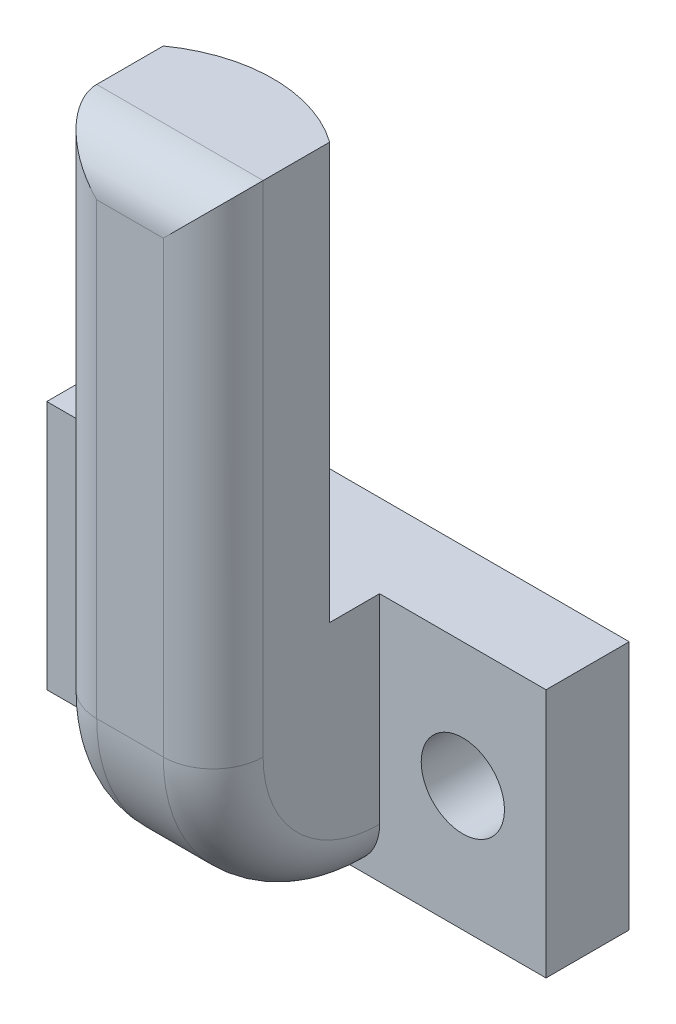
ISO-10303-21;
HEADER;
FILE_DESCRIPTION(('STEP AP214'),'2;1');
FILE_NAME('part.step','',(''),(''),'','','');
FILE_SCHEMA(('AUTOMOTIVE_DESIGN { 1 0 10303 214 1 1 1 1 }'));
ENDSEC;
DATA;
#1=APPLICATION_CONTEXT('core data for automotive mechanical design processes');
#2=APPLICATION_PROTOCOL_DEFINITION('international standard','automotive_design',2000,#1);
#3=PRODUCT_CONTEXT('',#1,'mechanical');
#4=PRODUCT('Part','Part','',(#3));
#5=PRODUCT_RELATED_PRODUCT_CATEGORY('part','',(#4));
#6=PRODUCT_DEFINITION_FORMATION('','',#4);
#7=PRODUCT_DEFINITION_CONTEXT('part definition',#1,'design');
#8=PRODUCT_DEFINITION('design','',#6,#7);
#9=PRODUCT_DEFINITION_SHAPE('','',#8);
#10=(LENGTH_UNIT() NAMED_UNIT(*) SI_UNIT(.MILLI.,.METRE.));
#11=(NAMED_UNIT(*) PLANE_ANGLE_UNIT() SI_UNIT($,.RADIAN.));
#12=(NAMED_UNIT(*) SI_UNIT($,.STERADIAN.) SOLID_ANGLE_UNIT());
#13=UNCERTAINTY_MEASURE_WITH_UNIT(LENGTH_MEASURE(1.E-05),#10,'distance_accuracy_value','');
#14=(GEOMETRIC_REPRESENTATION_CONTEXT(3) GLOBAL_UNCERTAINTY_ASSIGNED_CONTEXT((#13)) GLOBAL_UNIT_ASSIGNED_CONTEXT((#10,
#11,#12)) REPRESENTATION_CONTEXT('',''));
#15=CARTESIAN_POINT('',(0.,0.,0.));
#16=DIRECTION('',(0.,0.,1.));
#17=DIRECTION('',(1.,0.,0.));
#18=AXIS2_PLACEMENT_3D('',#15,#16,#17);
#19=CARTESIAN_POINT('',(0.,0.,5.));
#20=DIRECTION('',(0.,0.,1.));
#21=DIRECTION('',(1.,0.,0.));
#22=AXIS2_PLACEMENT_3D('',#19,#20,#21);
#23=PLANE('',#22);
#24=DIRECTION('',(0.,-1.,0.));
#25=VECTOR('',#24,1.);
#26=CARTESIAN_POINT('',(-5.,-7.5,5.));
#27=LINE('',#26,#25);
#28=CARTESIAN_POINT('',(-5.,7.5,5.));
#29=VERTEX_POINT('',#28);
#30=CARTESIAN_POINT('',(-5.,-4.5,5.));
#31=VERTEX_POINT('',#30);
#32=EDGE_CURVE('E219',#29,#31,#27,.T.);
#33=ORIENTED_EDGE('',*,*,#32,.F.);
#34=DIRECTION('',(-1.,0.,0.));
#35=VECTOR('',#34,1.);
#36=CARTESIAN_POINT('',(-15.,7.5,5.));
#37=LINE('',#36,#35);
#38=CARTESIAN_POINT('',(-15.,7.5,5.));
#39=VERTEX_POINT('',#38);
#40=EDGE_CURVE('E196',#29,#39,#37,.T.);
#41=ORIENTED_EDGE('',*,*,#40,.T.);
#42=DIRECTION('',(0.,-1.,0.));
#43=VECTOR('',#42,1.);
#44=CARTESIAN_POINT('',(-15.,7.5,5.));
#45=LINE('',#44,#43);
#46=CARTESIAN_POINT('',(-15.,-7.5,5.));
#47=VERTEX_POINT('',#46);
#48=EDGE_CURVE('E191',#39,#47,#45,.T.);
#49=ORIENTED_EDGE('',*,*,#48,.T.);
#50=DIRECTION('',(1.,0.,0.));
#51=VECTOR('',#50,1.);
#52=CARTESIAN_POINT('',(-15.,-7.5,5.));
#53=LINE('',#52,#51);
#54=CARTESIAN_POINT('',(-2.,-7.5,5.));
#55=VERTEX_POINT('',#54);
#56=EDGE_CURVE('E76',#47,#55,#53,.T.);
#57=ORIENTED_EDGE('',*,*,#56,.T.);
#58=CARTESIAN_POINT('',(-2.,-4.5,5.));
#59=DIRECTION('',(0.,0.,1.));
#60=DIRECTION('',(1.,0.,0.));
#61=AXIS2_PLACEMENT_3D('',#58,#59,#60);
#62=CIRCLE('',#61,3.);
#63=EDGE_CURVE('E46',#55,#31,#62,.F.);
#64=ORIENTED_EDGE('',*,*,#63,.T.);
#65=EDGE_LOOP('',(#33,#41,#49,#57,#64));
#66=FACE_BOUND('',#65,.T.);
#67=CARTESIAN_POINT('',(-10.,0.,5.));
#68=DIRECTION('',(0.,0.,1.));
#69=DIRECTION('',(1.,0.,0.));
#70=AXIS2_PLACEMENT_3D('',#67,#68,#69);
#71=CIRCLE('',#70,2.5);
#72=CARTESIAN_POINT('',(-7.5,0.,5.));
#73=VERTEX_POINT('',#72);
#74=EDGE_CURVE('E189',#73,#73,#71,.T.);
#75=ORIENTED_EDGE('',*,*,#74,.F.);
#76=EDGE_LOOP('',(#75));
#77=FACE_BOUND('',#76,.T.);
#78=ADVANCED_FACE('F37',(#66,#77),#23,.T.);
#79=DIRECTION('',(0.,1.,0.));
#80=VECTOR('',#79,1.);
#81=CARTESIAN_POINT('',(5.,-7.5,5.));
#82=LINE('',#81,#80);
#83=CARTESIAN_POINT('',(5.,-4.5,5.));
#84=VERTEX_POINT('',#83);
#85=CARTESIAN_POINT('',(5.,7.5,5.));
#86=VERTEX_POINT('',#85);
#87=EDGE_CURVE('E216',#84,#86,#82,.T.);
#88=ORIENTED_EDGE('',*,*,#87,.F.);
#89=CARTESIAN_POINT('',(2.,-4.5,5.));
#90=DIRECTION('',(0.,0.,1.));
#91=DIRECTION('',(1.,0.,0.));
#92=AXIS2_PLACEMENT_3D('',#89,#90,#91);
#93=CIRCLE('',#92,3.);
#94=CARTESIAN_POINT('',(2.,-7.5,5.));
#95=VERTEX_POINT('',#94);
#96=EDGE_CURVE('E11',#84,#95,#93,.F.);
#97=ORIENTED_EDGE('',*,*,#96,.T.);
#98=CARTESIAN_POINT('',(15.,-7.5,5.));
#99=VERTEX_POINT('',#98);
#100=EDGE_CURVE('E54',#95,#99,#53,.T.);
#101=ORIENTED_EDGE('',*,*,#100,.T.);
#102=DIRECTION('',(0.,1.,0.));
#103=VECTOR('',#102,1.);
#104=CARTESIAN_POINT('',(15.,7.5,5.));
#105=LINE('',#104,#103);
#106=CARTESIAN_POINT('',(15.,7.5,5.));
#107=VERTEX_POINT('',#106);
#108=EDGE_CURVE('E179',#99,#107,#105,.T.);
#109=ORIENTED_EDGE('',*,*,#108,.T.);
#110=EDGE_CURVE('E193',#107,#86,#37,.T.);
#111=ORIENTED_EDGE('',*,*,#110,.T.);
#112=EDGE_LOOP('',(#88,#97,#101,#109,#111));
#113=FACE_BOUND('',#112,.T.);
#114=CARTESIAN_POINT('',(10.,0.,5.));
#115=DIRECTION('',(0.,0.,1.));
#116=DIRECTION('',(-1.,0.,0.));
#117=AXIS2_PLACEMENT_3D('',#114,#115,#116);
#118=CIRCLE('',#117,2.50000000000001);
#119=CARTESIAN_POINT('',(7.49999999999999,0.,5.));
#120=VERTEX_POINT('',#119);
#121=EDGE_CURVE('E202',#120,#120,#118,.T.);
#122=ORIENTED_EDGE('',*,*,#121,.F.);
#123=EDGE_LOOP('',(#122));
#124=FACE_BOUND('',#123,.T.);
#125=ADVANCED_FACE('F282',(#113,#124),#23,.T.);
#126=CARTESIAN_POINT('',(0.,0.,0.));
#127=DIRECTION('',(0.,0.,1.));
#128=DIRECTION('',(1.,0.,0.));
#129=AXIS2_PLACEMENT_3D('',#126,#127,#128);
#130=PLANE('',#129);
#131=DIRECTION('',(0.,1.,0.));
#132=VECTOR('',#131,1.);
#133=CARTESIAN_POINT('',(15.,7.5,0.));
#134=LINE('',#133,#132);
#135=CARTESIAN_POINT('',(15.,-7.5,0.));
#136=VERTEX_POINT('',#135);
#137=CARTESIAN_POINT('',(15.,7.5,0.));
#138=VERTEX_POINT('',#137);
#139=EDGE_CURVE('E186',#136,#138,#134,.T.);
#140=ORIENTED_EDGE('',*,*,#139,.F.);
#141=DIRECTION('',(1.,0.,0.));
#142=VECTOR('',#141,1.);
#143=CARTESIAN_POINT('',(-15.,-7.5,0.));
#144=LINE('',#143,#142);
#145=CARTESIAN_POINT('',(-15.,-7.5,0.));
#146=VERTEX_POINT('',#145);
#147=EDGE_CURVE('E176',#146,#136,#144,.T.);
#148=ORIENTED_EDGE('',*,*,#147,.F.);
#149=DIRECTION('',(0.,-1.,0.));
#150=VECTOR('',#149,1.);
#151=CARTESIAN_POINT('',(-15.,7.5,0.));
#152=LINE('',#151,#150);
#153=CARTESIAN_POINT('',(-15.,7.5,0.));
#154=VERTEX_POINT('',#153);
#155=EDGE_CURVE('E180',#154,#146,#152,.T.);
#156=ORIENTED_EDGE('',*,*,#155,.F.);
#157=DIRECTION('',(-1.,0.,0.));
#158=VECTOR('',#157,1.);
#159=CARTESIAN_POINT('',(-15.,7.5,0.));
#160=LINE('',#159,#158);
#161=EDGE_CURVE('E183',#138,#154,#160,.T.);
#162=ORIENTED_EDGE('',*,*,#161,.F.);
#163=EDGE_LOOP('',(#140,#148,#156,#162));
#164=FACE_BOUND('',#163,.T.);
#165=CARTESIAN_POINT('',(-10.,0.,0.));
#166=DIRECTION('',(0.,0.,1.));
#167=DIRECTION('',(1.,0.,0.));
#168=AXIS2_PLACEMENT_3D('',#165,#166,#167);
#169=CIRCLE('',#168,2.5);
#170=CARTESIAN_POINT('',(-7.5,0.,0.));
#171=VERTEX_POINT('',#170);
#172=EDGE_CURVE('E199',#171,#171,#169,.T.);
#173=ORIENTED_EDGE('',*,*,#172,.T.);
#174=EDGE_LOOP('',(#173));
#175=FACE_BOUND('',#174,.T.);
#176=CARTESIAN_POINT('',(10.,0.,0.));
#177=DIRECTION('',(0.,0.,1.));
#178=DIRECTION('',(-1.,0.,0.));
#179=AXIS2_PLACEMENT_3D('',#176,#177,#178);
#180=CIRCLE('',#179,2.50000000000001);
#181=CARTESIAN_POINT('',(7.49999999999999,0.,0.));
#182=VERTEX_POINT('',#181);
#183=EDGE_CURVE('E205',#182,#182,#180,.T.);
#184=ORIENTED_EDGE('',*,*,#183,.T.);
#185=EDGE_LOOP('',(#184));
#186=FACE_BOUND('',#185,.T.);
#187=ADVANCED_FACE('F287',(#164,#175,#186),#130,.F.);
#188=CARTESIAN_POINT('',(15.,7.5,5.));
#189=DIRECTION('',(-1.,0.,0.));
#190=DIRECTION('',(0.,-1.,0.));
#191=AXIS2_PLACEMENT_3D('',#188,#189,#190);
#192=PLANE('',#191);
#193=ORIENTED_EDGE('',*,*,#139,.T.);
#194=DIRECTION('',(0.,0.,-1.));
#195=VECTOR('',#194,1.);
#196=CARTESIAN_POINT('',(15.,7.5,5.));
#197=LINE('',#196,#195);
#198=EDGE_CURVE('E164',#107,#138,#197,.T.);
#199=ORIENTED_EDGE('',*,*,#198,.F.);
#200=ORIENTED_EDGE('',*,*,#108,.F.);
#201=DIRECTION('',(0.,0.,-1.));
#202=VECTOR('',#201,1.);
#203=CARTESIAN_POINT('',(15.,-7.5,5.));
#204=LINE('',#203,#202);
#205=EDGE_CURVE('E173',#99,#136,#204,.T.);
#206=ORIENTED_EDGE('',*,*,#205,.T.);
#207=EDGE_LOOP('',(#193,#199,#200,#206));
#208=FACE_BOUND('',#207,.T.);
#209=ADVANCED_FACE('F295',(#208),#192,.F.);
#210=CARTESIAN_POINT('',(-15.,7.5,5.));
#211=DIRECTION('',(0.,-1.,0.));
#212=DIRECTION('',(0.,0.,-1.));
#213=AXIS2_PLACEMENT_3D('',#210,#211,#212);
#214=PLANE('',#213);
#215=DIRECTION('',(0.,0.,-1.));
#216=VECTOR('',#215,1.);
#217=CARTESIAN_POINT('',(-5.,7.5,15.));
#218=LINE('',#217,#216);
#219=CARTESIAN_POINT('',(-5.,7.5,8.));
#220=VERTEX_POINT('',#219);
#221=EDGE_CURVE('E213',#220,#29,#218,.T.);
#222=ORIENTED_EDGE('',*,*,#221,.F.);
#223=CARTESIAN_POINT('',(0.,7.5,15.));
#224=DIRECTION('',(0.,1.,0.));
#225=DIRECTION('',(0.,0.,1.));
#226=AXIS2_PLACEMENT_3D('',#223,#224,#225);
#227=CIRCLE('',#226,8.60232526704263);
#228=CARTESIAN_POINT('',(5.,7.5,8.));
#229=VERTEX_POINT('',#228);
#230=EDGE_CURVE('E140',#220,#229,#227,.F.);
#231=ORIENTED_EDGE('',*,*,#230,.T.);
#232=DIRECTION('',(0.,0.,-1.));
#233=VECTOR('',#232,1.);
#234=CARTESIAN_POINT('',(5.,7.5,15.));
#235=LINE('',#234,#233);
#236=EDGE_CURVE('E208',#229,#86,#235,.T.);
#237=ORIENTED_EDGE('',*,*,#236,.T.);
#238=ORIENTED_EDGE('',*,*,#110,.F.);
#239=ORIENTED_EDGE('',*,*,#198,.T.);
#240=ORIENTED_EDGE('',*,*,#161,.T.);
#241=DIRECTION('',(0.,0.,-1.));
#242=VECTOR('',#241,1.);
#243=CARTESIAN_POINT('',(-15.,7.5,5.));
#244=LINE('',#243,#242);
#245=EDGE_CURVE('E167',#39,#154,#244,.T.);
#246=ORIENTED_EDGE('',*,*,#245,.F.);
#247=ORIENTED_EDGE('',*,*,#40,.F.);
#248=EDGE_LOOP('',(#222,#231,#237,#238,#239,#240,#246,#247));
#249=FACE_BOUND('',#248,.T.);
#250=ADVANCED_FACE('F303',(#249),#214,.F.);
#251=CARTESIAN_POINT('',(-15.,7.5,5.));
#252=DIRECTION('',(1.,0.,0.));
#253=DIRECTION('',(0.,1.,0.));
#254=AXIS2_PLACEMENT_3D('',#251,#252,#253);
#255=PLANE('',#254);
#256=ORIENTED_EDGE('',*,*,#155,.T.);
#257=DIRECTION('',(0.,0.,-1.));
#258=VECTOR('',#257,1.);
#259=CARTESIAN_POINT('',(-15.,-7.5,5.));
#260=LINE('',#259,#258);
#261=EDGE_CURVE('E170',#47,#146,#260,.T.);
#262=ORIENTED_EDGE('',*,*,#261,.F.);
#263=ORIENTED_EDGE('',*,*,#48,.F.);
#264=ORIENTED_EDGE('',*,*,#245,.T.);
#265=EDGE_LOOP('',(#256,#262,#263,#264));
#266=FACE_BOUND('',#265,.T.);
#267=ADVANCED_FACE('F300',(#266),#255,.F.);
#268=CARTESIAN_POINT('',(-15.,-7.5,5.));
#269=DIRECTION('',(0.,1.,0.));
#270=DIRECTION('',(0.,0.,1.));
#271=AXIS2_PLACEMENT_3D('',#268,#269,#270);
#272=PLANE('',#271);
#273=ORIENTED_EDGE('',*,*,#100,.F.);
#274=DIRECTION('',(1.,0.,0.));
#275=VECTOR('',#274,1.);
#276=CARTESIAN_POINT('',(-5.,-7.5,5.));
#277=LINE('',#276,#275);
#278=EDGE_CURVE('E159',#95,#55,#277,.F.);
#279=ORIENTED_EDGE('',*,*,#278,.T.);
#280=ORIENTED_EDGE('',*,*,#56,.F.);
#281=ORIENTED_EDGE('',*,*,#261,.T.);
#282=ORIENTED_EDGE('',*,*,#147,.T.);
#283=ORIENTED_EDGE('',*,*,#205,.F.);
#284=EDGE_LOOP('',(#273,#279,#280,#281,#282,#283));
#285=FACE_BOUND('',#284,.T.);
#286=ADVANCED_FACE('F297',(#285),#272,.F.);
#287=CARTESIAN_POINT('',(-10.,0.,5.));
#288=DIRECTION('',(0.,0.,-1.));
#289=DIRECTION('',(-1.,0.,0.));
#290=AXIS2_PLACEMENT_3D('',#287,#288,#289);
#291=CYLINDRICAL_SURFACE('',#290,2.5);
#292=ORIENTED_EDGE('',*,*,#74,.T.);
#293=EDGE_LOOP('',(#292));
#294=FACE_BOUND('',#293,.T.);
#295=ORIENTED_EDGE('',*,*,#172,.F.);
#296=EDGE_LOOP('',(#295));
#297=FACE_BOUND('',#296,.T.);
#298=ADVANCED_FACE('F291',(#294,#297),#291,.F.);
#299=CARTESIAN_POINT('',(10.,0.,5.));
#300=DIRECTION('',(0.,0.,-1.));
#301=DIRECTION('',(-1.,0.,0.));
#302=AXIS2_PLACEMENT_3D('',#299,#300,#301);
#303=CYLINDRICAL_SURFACE('',#302,2.50000000000001);
#304=ORIENTED_EDGE('',*,*,#121,.T.);
#305=EDGE_LOOP('',(#304));
#306=FACE_BOUND('',#305,.T.);
#307=ORIENTED_EDGE('',*,*,#183,.F.);
#308=EDGE_LOOP('',(#307));
#309=FACE_BOUND('',#308,.T.);
#310=ADVANCED_FACE('F342',(#306,#309),#303,.F.);
#311=CARTESIAN_POINT('',(-5.,-7.5,15.));
#312=DIRECTION('',(1.,0.,0.));
#313=DIRECTION('',(0.,0.,-1.));
#314=AXIS2_PLACEMENT_3D('',#311,#312,#313);
#315=PLANE('',#314);
#316=ORIENTED_EDGE('',*,*,#32,.T.);
#317=CARTESIAN_POINT('',(-5.,2.5,5.));
#318=DIRECTION('',(1.,0.,0.));
#319=DIRECTION('',(0.,0.,-1.));
#320=AXIS2_PLACEMENT_3D('',#317,#318,#319);
#321=CIRCLE('',#320,7.);
#322=CARTESIAN_POINT('',(-5.,2.5,12.));
#323=VERTEX_POINT('',#322);
#324=EDGE_CURVE('E154',#31,#323,#321,.F.);
#325=ORIENTED_EDGE('',*,*,#324,.T.);
#326=DIRECTION('',(0.,-1.,0.));
#327=VECTOR('',#326,1.);
#328=CARTESIAN_POINT('',(-5.,32.5,12.));
#329=LINE('',#328,#327);
#330=CARTESIAN_POINT('',(-5.,32.5,12.));
#331=VERTEX_POINT('',#330);
#332=EDGE_CURVE('E157',#323,#331,#329,.F.);
#333=ORIENTED_EDGE('',*,*,#332,.T.);
#334=DIRECTION('',(0.,0.,1.));
#335=VECTOR('',#334,1.);
#336=CARTESIAN_POINT('',(-5.,32.5,0.));
#337=LINE('',#336,#335);
#338=CARTESIAN_POINT('',(-5.,32.5,8.));
#339=VERTEX_POINT('',#338);
#340=EDGE_CURVE('E114',#339,#331,#337,.T.);
#341=ORIENTED_EDGE('',*,*,#340,.F.);
#342=DIRECTION('',(0.,-1.,0.));
#343=VECTOR('',#342,1.);
#344=CARTESIAN_POINT('',(-5.,32.5,8.));
#345=LINE('',#344,#343);
#346=EDGE_CURVE('E222',#339,#220,#345,.T.);
#347=ORIENTED_EDGE('',*,*,#346,.T.);
#348=ORIENTED_EDGE('',*,*,#221,.T.);
#349=EDGE_LOOP('',(#316,#325,#333,#341,#347,#348));
#350=FACE_BOUND('',#349,.T.);
#351=ADVANCED_FACE('F269',(#350),#315,.F.);
#352=CARTESIAN_POINT('',(5.,-7.5,15.));
#353=DIRECTION('',(-1.,0.,0.));
#354=DIRECTION('',(0.,0.,1.));
#355=AXIS2_PLACEMENT_3D('',#352,#353,#354);
#356=PLANE('',#355);
#357=DIRECTION('',(0.,0.,-1.));
#358=VECTOR('',#357,1.);
#359=CARTESIAN_POINT('',(5.,32.5,0.));
#360=LINE('',#359,#358);
#361=CARTESIAN_POINT('',(5.,32.5,12.));
#362=VERTEX_POINT('',#361);
#363=CARTESIAN_POINT('',(5.,32.5,8.));
#364=VERTEX_POINT('',#363);
#365=EDGE_CURVE('E111',#362,#364,#360,.T.);
#366=ORIENTED_EDGE('',*,*,#365,.F.);
#367=DIRECTION('',(0.,1.,0.));
#368=VECTOR('',#367,1.);
#369=CARTESIAN_POINT('',(5.,2.5,12.));
#370=LINE('',#369,#368);
#371=CARTESIAN_POINT('',(5.,2.5,12.));
#372=VERTEX_POINT('',#371);
#373=EDGE_CURVE('E63',#362,#372,#370,.F.);
#374=ORIENTED_EDGE('',*,*,#373,.T.);
#375=CARTESIAN_POINT('',(5.,2.5,5.));
#376=DIRECTION('',(-1.,0.,0.));
#377=DIRECTION('',(0.,0.,1.));
#378=AXIS2_PLACEMENT_3D('',#375,#376,#377);
#379=CIRCLE('',#378,7.);
#380=EDGE_CURVE('E119',#372,#84,#379,.F.);
#381=ORIENTED_EDGE('',*,*,#380,.T.);
#382=ORIENTED_EDGE('',*,*,#87,.T.);
#383=ORIENTED_EDGE('',*,*,#236,.F.);
#384=DIRECTION('',(0.,-1.,0.));
#385=VECTOR('',#384,1.);
#386=CARTESIAN_POINT('',(5.,32.5,8.));
#387=LINE('',#386,#385);
#388=EDGE_CURVE('E125',#364,#229,#387,.T.);
#389=ORIENTED_EDGE('',*,*,#388,.F.);
#390=EDGE_LOOP('',(#366,#374,#381,#382,#383,#389));
#391=FACE_BOUND('',#390,.T.);
#392=ADVANCED_FACE('F122',(#391),#356,.F.);
#393=CARTESIAN_POINT('',(0.,0.,15.));
#394=DIRECTION('',(0.,0.,1.));
#395=DIRECTION('',(1.,0.,0.));
#396=AXIS2_PLACEMENT_3D('',#393,#394,#395);
#397=PLANE('',#396);
#398=DIRECTION('',(1.,0.,0.));
#399=VECTOR('',#398,1.);
#400=CARTESIAN_POINT('',(0.,29.5,15.));
#401=LINE('',#400,#399);
#402=CARTESIAN_POINT('',(2.,29.5,15.));
#403=VERTEX_POINT('',#402);
#404=CARTESIAN_POINT('',(-2.,29.5,15.));
#405=VERTEX_POINT('',#404);
#406=EDGE_CURVE('E138',#403,#405,#401,.F.);
#407=ORIENTED_EDGE('',*,*,#406,.T.);
#408=DIRECTION('',(0.,-1.,0.));
#409=VECTOR('',#408,1.);
#410=CARTESIAN_POINT('',(-2.,2.5,15.));
#411=LINE('',#410,#409);
#412=CARTESIAN_POINT('',(-2.,2.5,15.));
#413=VERTEX_POINT('',#412);
#414=EDGE_CURVE('E120',#405,#413,#411,.T.);
#415=ORIENTED_EDGE('',*,*,#414,.T.);
#416=DIRECTION('',(1.,0.,0.));
#417=VECTOR('',#416,1.);
#418=CARTESIAN_POINT('',(5.,2.5,15.));
#419=LINE('',#418,#417);
#420=CARTESIAN_POINT('',(2.,2.5,15.));
#421=VERTEX_POINT('',#420);
#422=EDGE_CURVE('E161',#413,#421,#419,.T.);
#423=ORIENTED_EDGE('',*,*,#422,.T.);
#424=DIRECTION('',(0.,1.,0.));
#425=VECTOR('',#424,1.);
#426=CARTESIAN_POINT('',(2.,32.5,15.));
#427=LINE('',#426,#425);
#428=EDGE_CURVE('E148',#421,#403,#427,.T.);
#429=ORIENTED_EDGE('',*,*,#428,.T.);
#430=EDGE_LOOP('',(#407,#415,#423,#429));
#431=FACE_BOUND('',#430,.T.);
#432=ADVANCED_FACE('F331',(#431),#397,.T.);
#433=CARTESIAN_POINT('',(0.,32.5,15.));
#434=DIRECTION('',(0.,-1.,0.));
#435=DIRECTION('',(0.,0.,-1.));
#436=AXIS2_PLACEMENT_3D('',#433,#434,#435);
#437=CYLINDRICAL_SURFACE('',#436,8.60232526704263);
#438=ORIENTED_EDGE('',*,*,#230,.F.);
#439=ORIENTED_EDGE('',*,*,#346,.F.);
#440=CARTESIAN_POINT('',(0.,32.5,15.));
#441=DIRECTION('',(0.,1.,0.));
#442=DIRECTION('',(0.,0.,1.));
#443=AXIS2_PLACEMENT_3D('',#440,#441,#442);
#444=CIRCLE('',#443,8.60232526704263);
#445=EDGE_CURVE('E227',#339,#364,#444,.F.);
#446=ORIENTED_EDGE('',*,*,#445,.T.);
#447=ORIENTED_EDGE('',*,*,#388,.T.);
#448=EDGE_LOOP('',(#438,#439,#446,#447));
#449=FACE_BOUND('',#448,.T.);
#450=ADVANCED_FACE('F233',(#449),#437,.T.);
#451=CARTESIAN_POINT('',(0.,32.5,0.));
#452=DIRECTION('',(0.,1.,0.));
#453=DIRECTION('',(0.,0.,1.));
#454=AXIS2_PLACEMENT_3D('',#451,#452,#453);
#455=PLANE('',#454);
#456=ORIENTED_EDGE('',*,*,#340,.T.);
#457=DIRECTION('',(1.,0.,0.));
#458=VECTOR('',#457,1.);
#459=CARTESIAN_POINT('',(0.,32.5,12.));
#460=LINE('',#459,#458);
#461=EDGE_CURVE('E107',#331,#362,#460,.T.);
#462=ORIENTED_EDGE('',*,*,#461,.T.);
#463=ORIENTED_EDGE('',*,*,#365,.T.);
#464=ORIENTED_EDGE('',*,*,#445,.F.);
#465=EDGE_LOOP('',(#456,#462,#463,#464));
#466=FACE_BOUND('',#465,.T.);
#467=ADVANCED_FACE('F108',(#466),#455,.T.);
#468=CARTESIAN_POINT('',(0.,2.5,5.));
#469=DIRECTION('',(-1.,0.,0.));
#470=DIRECTION('',(0.,0.,1.));
#471=AXIS2_PLACEMENT_3D('',#468,#469,#470);
#472=CYLINDRICAL_SURFACE('',#471,10.);
#473=ORIENTED_EDGE('',*,*,#422,.F.);
#474=CARTESIAN_POINT('',(-2.,2.5,5.));
#475=DIRECTION('',(1.,0.,0.));
#476=DIRECTION('',(0.,0.,-1.));
#477=AXIS2_PLACEMENT_3D('',#474,#475,#476);
#478=CIRCLE('',#477,10.);
#479=EDGE_CURVE('E150',#413,#55,#478,.T.);
#480=ORIENTED_EDGE('',*,*,#479,.T.);
#481=ORIENTED_EDGE('',*,*,#278,.F.);
#482=CARTESIAN_POINT('',(2.,2.5,5.));
#483=DIRECTION('',(-1.,0.,0.));
#484=DIRECTION('',(0.,0.,1.));
#485=AXIS2_PLACEMENT_3D('',#482,#483,#484);
#486=CIRCLE('',#485,10.);
#487=EDGE_CURVE('E152',#95,#421,#486,.T.);
#488=ORIENTED_EDGE('',*,*,#487,.T.);
#489=EDGE_LOOP('',(#473,#480,#481,#488));
#490=FACE_BOUND('',#489,.T.);
#491=ADVANCED_FACE('F310',(#490),#472,.T.);
#492=CARTESIAN_POINT('',(2.,2.5,5.));
#493=DIRECTION('',(-1.,0.,0.));
#494=DIRECTION('',(0.,0.,1.));
#495=AXIS2_PLACEMENT_3D('',#492,#493,#494);
#496=TOROIDAL_SURFACE('',#495,7.,3.);
#497=ORIENTED_EDGE('',*,*,#96,.F.);
#498=ORIENTED_EDGE('',*,*,#380,.F.);
#499=CARTESIAN_POINT('',(2.,2.5,12.));
#500=DIRECTION('',(0.,1.,0.));
#501=DIRECTION('',(0.,0.,1.));
#502=AXIS2_PLACEMENT_3D('',#499,#500,#501);
#503=CIRCLE('',#502,3.);
#504=EDGE_CURVE('E41',#421,#372,#503,.T.);
#505=ORIENTED_EDGE('',*,*,#504,.F.);
#506=ORIENTED_EDGE('',*,*,#487,.F.);
#507=EDGE_LOOP('',(#497,#498,#505,#506));
#508=FACE_BOUND('',#507,.T.);
#509=ADVANCED_FACE('F39',(#508),#496,.T.);
#510=CARTESIAN_POINT('',(2.,0.,12.));
#511=DIRECTION('',(0.,-1.,0.));
#512=DIRECTION('',(0.,0.,-1.));
#513=AXIS2_PLACEMENT_3D('',#510,#511,#512);
#514=CYLINDRICAL_SURFACE('',#513,3.);
#515=ORIENTED_EDGE('',*,*,#504,.T.);
#516=ORIENTED_EDGE('',*,*,#373,.F.);
#517=CARTESIAN_POINT('',(2.,29.5,12.));
#518=DIRECTION('',(0.707106781186547,-0.707106781186547,0.));
#519=DIRECTION('',(-0.707106781186547,-0.707106781186547,0.));
#520=AXIS2_PLACEMENT_3D('',#517,#518,#519);
#521=ELLIPSE('',#520,4.24264068711928,3.);
#522=EDGE_CURVE('E133',#403,#362,#521,.F.);
#523=ORIENTED_EDGE('',*,*,#522,.F.);
#524=ORIENTED_EDGE('',*,*,#428,.F.);
#525=EDGE_LOOP('',(#515,#516,#523,#524));
#526=FACE_BOUND('',#525,.T.);
#527=ADVANCED_FACE('F131',(#526),#514,.T.);
#528=CARTESIAN_POINT('',(0.,29.5,12.));
#529=DIRECTION('',(1.,0.,0.));
#530=DIRECTION('',(0.,0.,-1.));
#531=AXIS2_PLACEMENT_3D('',#528,#529,#530);
#532=CYLINDRICAL_SURFACE('',#531,3.);
#533=ORIENTED_EDGE('',*,*,#522,.T.);
#534=ORIENTED_EDGE('',*,*,#461,.F.);
#535=CARTESIAN_POINT('',(-2.,29.5,12.));
#536=DIRECTION('',(0.707106781186547,0.707106781186547,0.));
#537=DIRECTION('',(0.707106781186547,-0.707106781186547,0.));
#538=AXIS2_PLACEMENT_3D('',#535,#536,#537);
#539=ELLIPSE('',#538,4.24264068711928,3.);
#540=EDGE_CURVE('E139',#405,#331,#539,.F.);
#541=ORIENTED_EDGE('',*,*,#540,.F.);
#542=ORIENTED_EDGE('',*,*,#406,.F.);
#543=EDGE_LOOP('',(#533,#534,#541,#542));
#544=FACE_BOUND('',#543,.T.);
#545=ADVANCED_FACE('F137',(#544),#532,.T.);
#546=CARTESIAN_POINT('',(-2.,0.,12.));
#547=DIRECTION('',(0.,1.,0.));
#548=DIRECTION('',(0.,0.,1.));
#549=AXIS2_PLACEMENT_3D('',#546,#547,#548);
#550=CYLINDRICAL_SURFACE('',#549,3.);
#551=ORIENTED_EDGE('',*,*,#540,.T.);
#552=ORIENTED_EDGE('',*,*,#332,.F.);
#553=CARTESIAN_POINT('',(-2.,2.5,12.));
#554=DIRECTION('',(0.,-1.,0.));
#555=DIRECTION('',(0.,0.,-1.));
#556=AXIS2_PLACEMENT_3D('',#553,#554,#555);
#557=CIRCLE('',#556,3.);
#558=EDGE_CURVE('E88',#413,#323,#557,.T.);
#559=ORIENTED_EDGE('',*,*,#558,.F.);
#560=ORIENTED_EDGE('',*,*,#414,.F.);
#561=EDGE_LOOP('',(#551,#552,#559,#560));
#562=FACE_BOUND('',#561,.T.);
#563=ADVANCED_FACE('F273',(#562),#550,.T.);
#564=CARTESIAN_POINT('',(-2.,2.5,5.));
#565=DIRECTION('',(1.,0.,0.));
#566=DIRECTION('',(0.,0.,-1.));
#567=AXIS2_PLACEMENT_3D('',#564,#565,#566);
#568=TOROIDAL_SURFACE('',#567,7.,3.);
#569=ORIENTED_EDGE('',*,*,#63,.F.);
#570=ORIENTED_EDGE('',*,*,#479,.F.);
#571=ORIENTED_EDGE('',*,*,#558,.T.);
#572=ORIENTED_EDGE('',*,*,#324,.F.);
#573=EDGE_LOOP('',(#569,#570,#571,#572));
#574=FACE_BOUND('',#573,.T.);
#575=ADVANCED_FACE('F271',(#574),#568,.T.);
#576=CLOSED_SHELL('',(#78,#125,#187,#209,#250,#267,#286,#298,#310,#351,#392,#432,#450,#467,#491,
#509,#527,#545,#563,#575));
#577=MANIFOLD_SOLID_BREP('B2',#576);
#578=ADVANCED_BREP_SHAPE_REPRESENTATION('',(#18,#577),#14);
#579=SHAPE_DEFINITION_REPRESENTATION(#9,#578);
ENDSEC;
END-ISO-10303-21;
